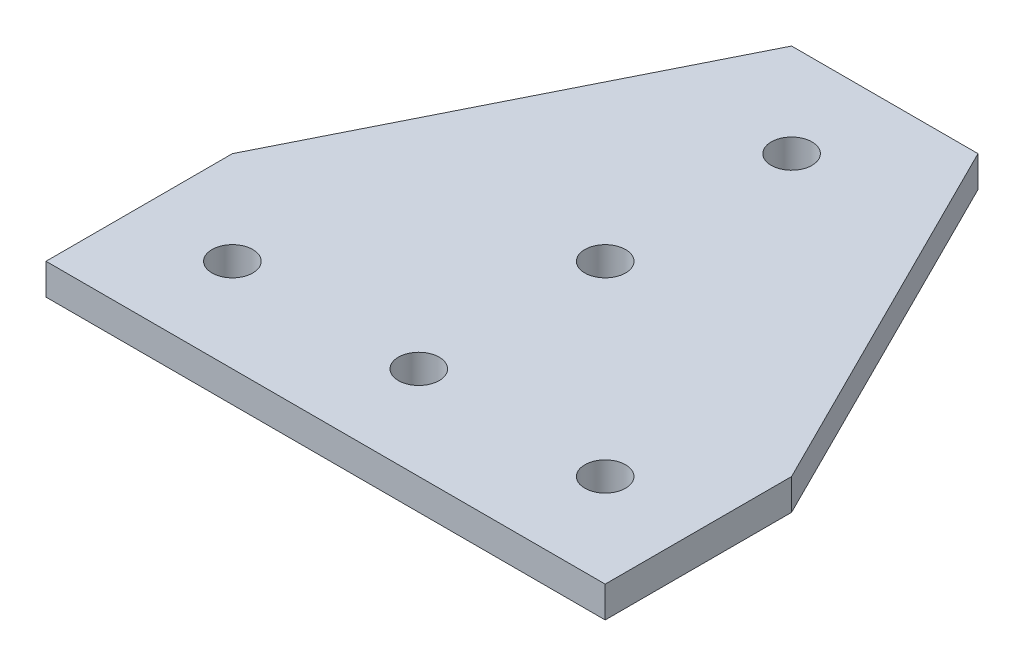
ISO-10303-21;
HEADER;
FILE_DESCRIPTION(('STEP AP214'),'2;1');
FILE_NAME('part.step','',(''),(''),'','','');
FILE_SCHEMA(('AUTOMOTIVE_DESIGN { 1 0 10303 214 1 1 1 1 }'));
ENDSEC;
DATA;
#1=APPLICATION_CONTEXT('core data for automotive mechanical design processes');
#2=APPLICATION_PROTOCOL_DEFINITION('international standard','automotive_design',2000,#1);
#3=PRODUCT_CONTEXT('',#1,'mechanical');
#4=PRODUCT('Part','Part','',(#3));
#5=PRODUCT_RELATED_PRODUCT_CATEGORY('part','',(#4));
#6=PRODUCT_DEFINITION_FORMATION('','',#4);
#7=PRODUCT_DEFINITION_CONTEXT('part definition',#1,'design');
#8=PRODUCT_DEFINITION('design','',#6,#7);
#9=PRODUCT_DEFINITION_SHAPE('','',#8);
#10=(LENGTH_UNIT() NAMED_UNIT(*) SI_UNIT(.MILLI.,.METRE.));
#11=(NAMED_UNIT(*) PLANE_ANGLE_UNIT() SI_UNIT($,.RADIAN.));
#12=(NAMED_UNIT(*) SI_UNIT($,.STERADIAN.) SOLID_ANGLE_UNIT());
#13=UNCERTAINTY_MEASURE_WITH_UNIT(LENGTH_MEASURE(1.E-05),#10,'distance_accuracy_value','');
#14=(GEOMETRIC_REPRESENTATION_CONTEXT(3) GLOBAL_UNCERTAINTY_ASSIGNED_CONTEXT((#13)) GLOBAL_UNIT_ASSIGNED_CONTEXT((#10,
#11,#12)) REPRESENTATION_CONTEXT('',''));
#15=CARTESIAN_POINT('',(0.,0.,0.));
#16=DIRECTION('',(0.,0.,1.));
#17=DIRECTION('',(1.,0.,0.));
#18=AXIS2_PLACEMENT_3D('',#15,#16,#17);
#19=CARTESIAN_POINT('',(57.15,-3.175,57.15));
#20=DIRECTION('',(-1.,0.,0.));
#21=DIRECTION('',(0.,0.,1.));
#22=AXIS2_PLACEMENT_3D('',#19,#20,#21);
#23=PLANE('',#22);
#24=DIRECTION('',(0.,0.,-1.));
#25=VECTOR('',#24,1.);
#26=CARTESIAN_POINT('',(57.15,-3.175,57.15));
#27=LINE('',#26,#25);
#28=CARTESIAN_POINT('',(57.15,-3.175,57.15));
#29=VERTEX_POINT('',#28);
#30=CARTESIAN_POINT('',(57.15,-3.175,19.05));
#31=VERTEX_POINT('',#30);
#32=EDGE_CURVE('E110',#29,#31,#27,.T.);
#33=ORIENTED_EDGE('',*,*,#32,.T.);
#34=DIRECTION('',(0.,1.,0.));
#35=VECTOR('',#34,1.);
#36=CARTESIAN_POINT('',(57.15,-3.175,19.05));
#37=LINE('',#36,#35);
#38=CARTESIAN_POINT('',(57.15,3.175,19.05));
#39=VERTEX_POINT('',#38);
#40=EDGE_CURVE('E94',#31,#39,#37,.T.);
#41=ORIENTED_EDGE('',*,*,#40,.T.);
#42=DIRECTION('',(0.,0.,-1.));
#43=VECTOR('',#42,1.);
#44=CARTESIAN_POINT('',(57.15,3.175,57.15));
#45=LINE('',#44,#43);
#46=CARTESIAN_POINT('',(57.15,3.175,57.15));
#47=VERTEX_POINT('',#46);
#48=EDGE_CURVE('E131',#47,#39,#45,.T.);
#49=ORIENTED_EDGE('',*,*,#48,.F.);
#50=DIRECTION('',(0.,1.,0.));
#51=VECTOR('',#50,1.);
#52=CARTESIAN_POINT('',(57.15,-3.175,57.15));
#53=LINE('',#52,#51);
#54=EDGE_CURVE('E117',#29,#47,#53,.T.);
#55=ORIENTED_EDGE('',*,*,#54,.F.);
#56=EDGE_LOOP('',(#33,#41,#49,#55));
#57=FACE_BOUND('',#56,.T.);
#58=ADVANCED_FACE('F41',(#57),#23,.F.);
#59=CARTESIAN_POINT('',(-57.15,3.175,57.15));
#60=DIRECTION('',(0.,-1.,0.));
#61=DIRECTION('',(0.,0.,-1.));
#62=AXIS2_PLACEMENT_3D('',#59,#60,#61);
#63=PLANE('',#62);
#64=CARTESIAN_POINT('',(38.1,3.175,38.1));
#65=DIRECTION('',(0.,1.,0.));
#66=DIRECTION('',(0.,0.,-1.));
#67=AXIS2_PLACEMENT_3D('',#64,#65,#66);
#68=CIRCLE('',#67,4.1656);
#69=CARTESIAN_POINT('',(38.1,3.175,33.9344));
#70=VERTEX_POINT('',#69);
#71=EDGE_CURVE('E192',#70,#70,#68,.T.);
#72=ORIENTED_EDGE('',*,*,#71,.F.);
#73=EDGE_LOOP('',(#72));
#74=FACE_BOUND('',#73,.T.);
#75=CARTESIAN_POINT('',(-38.1,3.175,38.1));
#76=DIRECTION('',(0.,1.,0.));
#77=DIRECTION('',(0.,0.,1.));
#78=AXIS2_PLACEMENT_3D('',#75,#76,#77);
#79=CIRCLE('',#78,4.1656);
#80=CARTESIAN_POINT('',(-38.1,3.175,42.2656));
#81=VERTEX_POINT('',#80);
#82=EDGE_CURVE('E194',#81,#81,#79,.T.);
#83=ORIENTED_EDGE('',*,*,#82,.F.);
#84=EDGE_LOOP('',(#83));
#85=FACE_BOUND('',#84,.T.);
#86=CARTESIAN_POINT('',(0.,3.175,0.));
#87=DIRECTION('',(0.,1.,0.));
#88=DIRECTION('',(0.,0.,1.));
#89=AXIS2_PLACEMENT_3D('',#86,#87,#88);
#90=CIRCLE('',#89,4.1656);
#91=CARTESIAN_POINT('',(0.,3.175,4.16559999999999));
#92=VERTEX_POINT('',#91);
#93=EDGE_CURVE('E205',#92,#92,#90,.T.);
#94=ORIENTED_EDGE('',*,*,#93,.F.);
#95=EDGE_LOOP('',(#94));
#96=FACE_BOUND('',#95,.T.);
#97=CARTESIAN_POINT('',(0.,3.175,-38.1));
#98=DIRECTION('',(0.,1.,0.));
#99=DIRECTION('',(0.,0.,1.));
#100=AXIS2_PLACEMENT_3D('',#97,#98,#99);
#101=CIRCLE('',#100,4.1656);
#102=CARTESIAN_POINT('',(0.,3.175,-33.9344));
#103=VERTEX_POINT('',#102);
#104=EDGE_CURVE('E208',#103,#103,#101,.T.);
#105=ORIENTED_EDGE('',*,*,#104,.F.);
#106=EDGE_LOOP('',(#105));
#107=FACE_BOUND('',#106,.T.);
#108=ORIENTED_EDGE('',*,*,#48,.T.);
#109=DIRECTION('',(0.447213595499958,0.,0.894427190999916));
#110=VECTOR('',#109,1.);
#111=CARTESIAN_POINT('',(57.15,3.175,19.05));
#112=LINE('',#111,#110);
#113=CARTESIAN_POINT('',(19.05,3.175,-57.15));
#114=VERTEX_POINT('',#113);
#115=EDGE_CURVE('E96',#114,#39,#112,.T.);
#116=ORIENTED_EDGE('',*,*,#115,.F.);
#117=DIRECTION('',(-1.,0.,0.));
#118=VECTOR('',#117,1.);
#119=CARTESIAN_POINT('',(-57.15,3.175,-57.15));
#120=LINE('',#119,#118);
#121=CARTESIAN_POINT('',(-19.05,3.175,-57.15));
#122=VERTEX_POINT('',#121);
#123=EDGE_CURVE('E64',#114,#122,#120,.T.);
#124=ORIENTED_EDGE('',*,*,#123,.T.);
#125=DIRECTION('',(0.447213595499958,0.,-0.894427190999916));
#126=VECTOR('',#125,1.);
#127=CARTESIAN_POINT('',(-57.15,3.175,19.05));
#128=LINE('',#127,#126);
#129=CARTESIAN_POINT('',(-57.15,3.175,19.05));
#130=VERTEX_POINT('',#129);
#131=EDGE_CURVE('E101',#130,#122,#128,.T.);
#132=ORIENTED_EDGE('',*,*,#131,.F.);
#133=DIRECTION('',(0.,0.,-1.));
#134=VECTOR('',#133,1.);
#135=CARTESIAN_POINT('',(-57.15,3.175,57.15));
#136=LINE('',#135,#134);
#137=CARTESIAN_POINT('',(-57.15,3.175,57.15));
#138=VERTEX_POINT('',#137);
#139=EDGE_CURVE('E122',#138,#130,#136,.T.);
#140=ORIENTED_EDGE('',*,*,#139,.F.);
#141=DIRECTION('',(-1.,0.,0.));
#142=VECTOR('',#141,1.);
#143=CARTESIAN_POINT('',(-57.15,3.175,57.15));
#144=LINE('',#143,#142);
#145=EDGE_CURVE('E225',#47,#138,#144,.T.);
#146=ORIENTED_EDGE('',*,*,#145,.F.);
#147=EDGE_LOOP('',(#108,#116,#124,#132,#140,#146));
#148=FACE_BOUND('',#147,.T.);
#149=CARTESIAN_POINT('',(0.,3.175,38.1));
#150=DIRECTION('',(0.,1.,0.));
#151=DIRECTION('',(0.,0.,1.));
#152=AXIS2_PLACEMENT_3D('',#149,#150,#151);
#153=CIRCLE('',#152,4.1656);
#154=CARTESIAN_POINT('',(0.,3.175,42.2656));
#155=VERTEX_POINT('',#154);
#156=EDGE_CURVE('E11',#155,#155,#153,.T.);
#157=ORIENTED_EDGE('',*,*,#156,.F.);
#158=EDGE_LOOP('',(#157));
#159=FACE_BOUND('',#158,.T.);
#160=ADVANCED_FACE('F141',(#74,#85,#96,#107,#148,#159),#63,.F.);
#161=CARTESIAN_POINT('',(-57.15,-3.175,57.15));
#162=DIRECTION('',(1.,0.,0.));
#163=DIRECTION('',(0.,0.,-1.));
#164=AXIS2_PLACEMENT_3D('',#161,#162,#163);
#165=PLANE('',#164);
#166=ORIENTED_EDGE('',*,*,#139,.T.);
#167=DIRECTION('',(0.,1.,0.));
#168=VECTOR('',#167,1.);
#169=CARTESIAN_POINT('',(-57.15,-3.175,19.05));
#170=LINE('',#169,#168);
#171=CARTESIAN_POINT('',(-57.15,-3.175,19.05));
#172=VERTEX_POINT('',#171);
#173=EDGE_CURVE('E218',#172,#130,#170,.T.);
#174=ORIENTED_EDGE('',*,*,#173,.F.);
#175=DIRECTION('',(0.,0.,-1.));
#176=VECTOR('',#175,1.);
#177=CARTESIAN_POINT('',(-57.15,-3.175,57.15));
#178=LINE('',#177,#176);
#179=CARTESIAN_POINT('',(-57.15,-3.175,57.15));
#180=VERTEX_POINT('',#179);
#181=EDGE_CURVE('E118',#180,#172,#178,.T.);
#182=ORIENTED_EDGE('',*,*,#181,.F.);
#183=DIRECTION('',(0.,-1.,0.));
#184=VECTOR('',#183,1.);
#185=CARTESIAN_POINT('',(-57.15,-3.175,57.15));
#186=LINE('',#185,#184);
#187=EDGE_CURVE('E124',#138,#180,#186,.T.);
#188=ORIENTED_EDGE('',*,*,#187,.F.);
#189=EDGE_LOOP('',(#166,#174,#182,#188));
#190=FACE_BOUND('',#189,.T.);
#191=ADVANCED_FACE('F143',(#190),#165,.F.);
#192=CARTESIAN_POINT('',(-57.15,-3.175,57.15));
#193=DIRECTION('',(0.,1.,0.));
#194=DIRECTION('',(0.,0.,1.));
#195=AXIS2_PLACEMENT_3D('',#192,#193,#194);
#196=PLANE('',#195);
#197=CARTESIAN_POINT('',(38.1,-3.175,38.1));
#198=DIRECTION('',(0.,1.,0.));
#199=DIRECTION('',(0.,0.,-1.));
#200=AXIS2_PLACEMENT_3D('',#197,#198,#199);
#201=CIRCLE('',#200,4.1656);
#202=CARTESIAN_POINT('',(38.1,-3.175,33.9344));
#203=VERTEX_POINT('',#202);
#204=EDGE_CURVE('E190',#203,#203,#201,.T.);
#205=ORIENTED_EDGE('',*,*,#204,.T.);
#206=EDGE_LOOP('',(#205));
#207=FACE_BOUND('',#206,.T.);
#208=CARTESIAN_POINT('',(-38.1,-3.175,38.1));
#209=DIRECTION('',(0.,1.,0.));
#210=DIRECTION('',(0.,0.,1.));
#211=AXIS2_PLACEMENT_3D('',#208,#209,#210);
#212=CIRCLE('',#211,4.1656);
#213=CARTESIAN_POINT('',(-38.1,-3.175,42.2656));
#214=VERTEX_POINT('',#213);
#215=EDGE_CURVE('E197',#214,#214,#212,.T.);
#216=ORIENTED_EDGE('',*,*,#215,.T.);
#217=EDGE_LOOP('',(#216));
#218=FACE_BOUND('',#217,.T.);
#219=CARTESIAN_POINT('',(0.,-3.175,0.));
#220=DIRECTION('',(0.,1.,0.));
#221=DIRECTION('',(0.,0.,1.));
#222=AXIS2_PLACEMENT_3D('',#219,#220,#221);
#223=CIRCLE('',#222,4.1656);
#224=CARTESIAN_POINT('',(0.,-3.175,4.16559999999999));
#225=VERTEX_POINT('',#224);
#226=EDGE_CURVE('E200',#225,#225,#223,.T.);
#227=ORIENTED_EDGE('',*,*,#226,.T.);
#228=EDGE_LOOP('',(#227));
#229=FACE_BOUND('',#228,.T.);
#230=CARTESIAN_POINT('',(0.,-3.175,-38.1));
#231=DIRECTION('',(0.,1.,0.));
#232=DIRECTION('',(0.,0.,1.));
#233=AXIS2_PLACEMENT_3D('',#230,#231,#232);
#234=CIRCLE('',#233,4.1656);
#235=CARTESIAN_POINT('',(0.,-3.175,-33.9344));
#236=VERTEX_POINT('',#235);
#237=EDGE_CURVE('E209',#236,#236,#234,.T.);
#238=ORIENTED_EDGE('',*,*,#237,.T.);
#239=EDGE_LOOP('',(#238));
#240=FACE_BOUND('',#239,.T.);
#241=DIRECTION('',(1.,0.,0.));
#242=VECTOR('',#241,1.);
#243=CARTESIAN_POINT('',(-57.15,-3.175,-57.15));
#244=LINE('',#243,#242);
#245=CARTESIAN_POINT('',(-19.05,-3.175,-57.15));
#246=VERTEX_POINT('',#245);
#247=CARTESIAN_POINT('',(19.05,-3.175,-57.15));
#248=VERTEX_POINT('',#247);
#249=EDGE_CURVE('E114',#246,#248,#244,.T.);
#250=ORIENTED_EDGE('',*,*,#249,.T.);
#251=DIRECTION('',(0.447213595499958,0.,0.894427190999916));
#252=VECTOR('',#251,1.);
#253=CARTESIAN_POINT('',(57.15,-3.175,19.05));
#254=LINE('',#253,#252);
#255=EDGE_CURVE('E56',#248,#31,#254,.T.);
#256=ORIENTED_EDGE('',*,*,#255,.T.);
#257=ORIENTED_EDGE('',*,*,#32,.F.);
#258=DIRECTION('',(1.,0.,0.));
#259=VECTOR('',#258,1.);
#260=CARTESIAN_POINT('',(-57.15,-3.175,57.15));
#261=LINE('',#260,#259);
#262=EDGE_CURVE('E119',#180,#29,#261,.T.);
#263=ORIENTED_EDGE('',*,*,#262,.F.);
#264=ORIENTED_EDGE('',*,*,#181,.T.);
#265=DIRECTION('',(0.447213595499958,0.,-0.894427190999916));
#266=VECTOR('',#265,1.);
#267=CARTESIAN_POINT('',(-57.15,-3.175,19.05));
#268=LINE('',#267,#266);
#269=EDGE_CURVE('E216',#172,#246,#268,.T.);
#270=ORIENTED_EDGE('',*,*,#269,.T.);
#271=EDGE_LOOP('',(#250,#256,#257,#263,#264,#270));
#272=FACE_BOUND('',#271,.T.);
#273=CARTESIAN_POINT('',(0.,-3.175,38.1));
#274=DIRECTION('',(0.,1.,0.));
#275=DIRECTION('',(0.,0.,1.));
#276=AXIS2_PLACEMENT_3D('',#273,#274,#275);
#277=CIRCLE('',#276,4.1656);
#278=CARTESIAN_POINT('',(0.,-3.175,42.2656));
#279=VERTEX_POINT('',#278);
#280=EDGE_CURVE('E49',#279,#279,#277,.T.);
#281=ORIENTED_EDGE('',*,*,#280,.T.);
#282=EDGE_LOOP('',(#281));
#283=FACE_BOUND('',#282,.T.);
#284=ADVANCED_FACE('F107',(#207,#218,#229,#240,#272,#283),#196,.F.);
#285=CARTESIAN_POINT('',(57.15,3.175,57.15));
#286=DIRECTION('',(0.,0.,-1.));
#287=DIRECTION('',(-1.,0.,0.));
#288=AXIS2_PLACEMENT_3D('',#285,#286,#287);
#289=PLANE('',#288);
#290=ORIENTED_EDGE('',*,*,#54,.T.);
#291=ORIENTED_EDGE('',*,*,#145,.T.);
#292=ORIENTED_EDGE('',*,*,#187,.T.);
#293=ORIENTED_EDGE('',*,*,#262,.T.);
#294=EDGE_LOOP('',(#290,#291,#292,#293));
#295=FACE_BOUND('',#294,.T.);
#296=ADVANCED_FACE('F157',(#295),#289,.F.);
#297=CARTESIAN_POINT('',(57.15,3.175,-57.15));
#298=DIRECTION('',(0.,0.,-1.));
#299=DIRECTION('',(-1.,0.,0.));
#300=AXIS2_PLACEMENT_3D('',#297,#298,#299);
#301=PLANE('',#300);
#302=DIRECTION('',(0.,1.,0.));
#303=VECTOR('',#302,1.);
#304=CARTESIAN_POINT('',(19.05,-3.175,-57.15));
#305=LINE('',#304,#303);
#306=EDGE_CURVE('E102',#248,#114,#305,.T.);
#307=ORIENTED_EDGE('',*,*,#306,.F.);
#308=ORIENTED_EDGE('',*,*,#249,.F.);
#309=DIRECTION('',(0.,1.,0.));
#310=VECTOR('',#309,1.);
#311=CARTESIAN_POINT('',(-19.05,-3.175,-57.15));
#312=LINE('',#311,#310);
#313=EDGE_CURVE('E220',#246,#122,#312,.T.);
#314=ORIENTED_EDGE('',*,*,#313,.T.);
#315=ORIENTED_EDGE('',*,*,#123,.F.);
#316=EDGE_LOOP('',(#307,#308,#314,#315));
#317=FACE_BOUND('',#316,.T.);
#318=ADVANCED_FACE('F159',(#317),#301,.T.);
#319=CARTESIAN_POINT('',(-57.15,-3.175,19.05));
#320=DIRECTION('',(0.894427190999916,0.,0.447213595499958));
#321=DIRECTION('',(0.447213595499958,0.,-0.894427190999916));
#322=AXIS2_PLACEMENT_3D('',#319,#320,#321);
#323=PLANE('',#322);
#324=ORIENTED_EDGE('',*,*,#131,.T.);
#325=ORIENTED_EDGE('',*,*,#313,.F.);
#326=ORIENTED_EDGE('',*,*,#269,.F.);
#327=ORIENTED_EDGE('',*,*,#173,.T.);
#328=EDGE_LOOP('',(#324,#325,#326,#327));
#329=FACE_BOUND('',#328,.T.);
#330=ADVANCED_FACE('F162',(#329),#323,.F.);
#331=CARTESIAN_POINT('',(57.15,-3.175,19.05));
#332=DIRECTION('',(-0.894427190999916,0.,0.447213595499958));
#333=DIRECTION('',(0.447213595499958,0.,0.894427190999916));
#334=AXIS2_PLACEMENT_3D('',#331,#332,#333);
#335=PLANE('',#334);
#336=ORIENTED_EDGE('',*,*,#115,.T.);
#337=ORIENTED_EDGE('',*,*,#40,.F.);
#338=ORIENTED_EDGE('',*,*,#255,.F.);
#339=ORIENTED_EDGE('',*,*,#306,.T.);
#340=EDGE_LOOP('',(#336,#337,#338,#339));
#341=FACE_BOUND('',#340,.T.);
#342=ADVANCED_FACE('F95',(#341),#335,.F.);
#343=CARTESIAN_POINT('',(0.,-3.175,-38.1));
#344=DIRECTION('',(0.,1.,0.));
#345=DIRECTION('',(0.,0.,1.));
#346=AXIS2_PLACEMENT_3D('',#343,#344,#345);
#347=CYLINDRICAL_SURFACE('',#346,4.1656);
#348=ORIENTED_EDGE('',*,*,#237,.F.);
#349=EDGE_LOOP('',(#348));
#350=FACE_BOUND('',#349,.T.);
#351=ORIENTED_EDGE('',*,*,#104,.T.);
#352=EDGE_LOOP('',(#351));
#353=FACE_BOUND('',#352,.T.);
#354=ADVANCED_FACE('F172',(#350,#353),#347,.F.);
#355=CARTESIAN_POINT('',(0.,-3.175,0.));
#356=DIRECTION('',(0.,1.,0.));
#357=DIRECTION('',(0.,0.,1.));
#358=AXIS2_PLACEMENT_3D('',#355,#356,#357);
#359=CYLINDRICAL_SURFACE('',#358,4.1656);
#360=ORIENTED_EDGE('',*,*,#226,.F.);
#361=EDGE_LOOP('',(#360));
#362=FACE_BOUND('',#361,.T.);
#363=ORIENTED_EDGE('',*,*,#93,.T.);
#364=EDGE_LOOP('',(#363));
#365=FACE_BOUND('',#364,.T.);
#366=ADVANCED_FACE('F138',(#362,#365),#359,.F.);
#367=CARTESIAN_POINT('',(0.,-3.175,38.1));
#368=DIRECTION('',(0.,1.,0.));
#369=DIRECTION('',(0.,0.,1.));
#370=AXIS2_PLACEMENT_3D('',#367,#368,#369);
#371=CYLINDRICAL_SURFACE('',#370,4.1656);
#372=ORIENTED_EDGE('',*,*,#280,.F.);
#373=EDGE_LOOP('',(#372));
#374=FACE_BOUND('',#373,.T.);
#375=ORIENTED_EDGE('',*,*,#156,.T.);
#376=EDGE_LOOP('',(#375));
#377=FACE_BOUND('',#376,.T.);
#378=ADVANCED_FACE('F43',(#374,#377),#371,.F.);
#379=CARTESIAN_POINT('',(-38.1,-3.175,38.1));
#380=DIRECTION('',(0.,1.,0.));
#381=DIRECTION('',(0.,0.,1.));
#382=AXIS2_PLACEMENT_3D('',#379,#380,#381);
#383=CYLINDRICAL_SURFACE('',#382,4.1656);
#384=ORIENTED_EDGE('',*,*,#215,.F.);
#385=EDGE_LOOP('',(#384));
#386=FACE_BOUND('',#385,.T.);
#387=ORIENTED_EDGE('',*,*,#82,.T.);
#388=EDGE_LOOP('',(#387));
#389=FACE_BOUND('',#388,.T.);
#390=ADVANCED_FACE('F137',(#386,#389),#383,.F.);
#391=CARTESIAN_POINT('',(38.1,-3.175,38.1));
#392=DIRECTION('',(0.,1.,0.));
#393=DIRECTION('',(0.,0.,1.));
#394=AXIS2_PLACEMENT_3D('',#391,#392,#393);
#395=CYLINDRICAL_SURFACE('',#394,4.1656);
#396=ORIENTED_EDGE('',*,*,#204,.F.);
#397=EDGE_LOOP('',(#396));
#398=FACE_BOUND('',#397,.T.);
#399=ORIENTED_EDGE('',*,*,#71,.T.);
#400=EDGE_LOOP('',(#399));
#401=FACE_BOUND('',#400,.T.);
#402=ADVANCED_FACE('F181',(#398,#401),#395,.F.);
#403=CLOSED_SHELL('',(#58,#160,#191,#284,#296,#318,#330,#342,#354,#366,#378,#390,#402));
#404=MANIFOLD_SOLID_BREP('B2',#403);
#405=ADVANCED_BREP_SHAPE_REPRESENTATION('',(#18,#404),#14);
#406=SHAPE_DEFINITION_REPRESENTATION(#9,#405);
ENDSEC;
END-ISO-10303-21;
